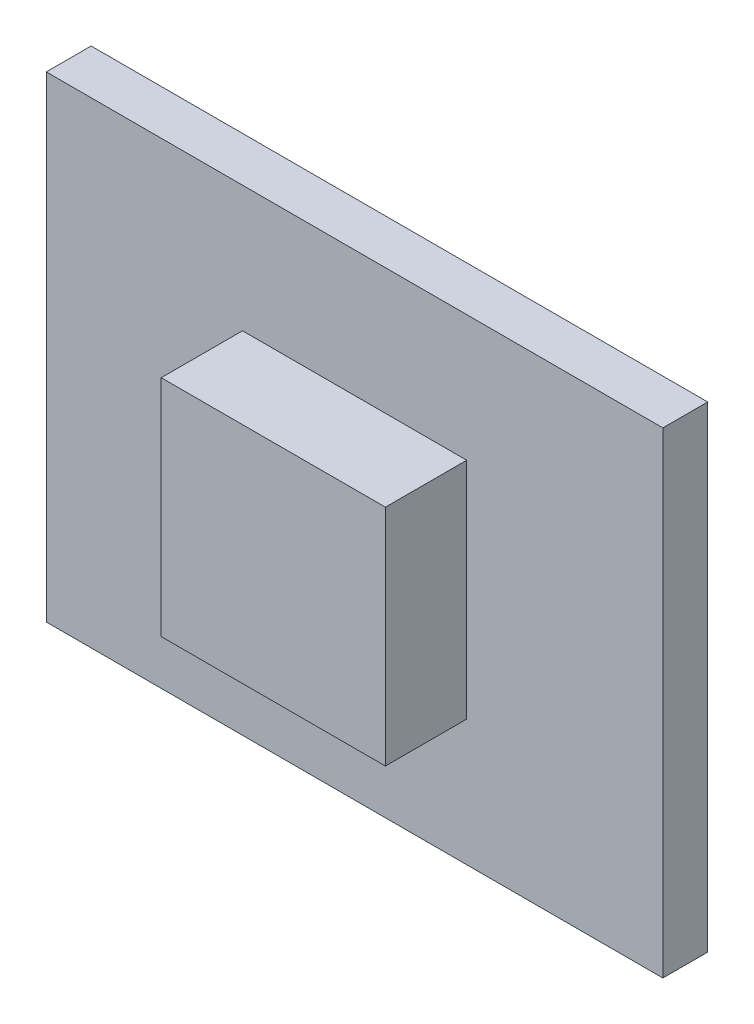
ISO-10303-21;
HEADER;
FILE_DESCRIPTION(('STEP AP214'),'2;1');
FILE_NAME('part.step','',(''),(''),'','','');
FILE_SCHEMA(('AUTOMOTIVE_DESIGN { 1 0 10303 214 1 1 1 1 }'));
ENDSEC;
DATA;
#1=APPLICATION_CONTEXT('core data for automotive mechanical design processes');
#2=APPLICATION_PROTOCOL_DEFINITION('international standard','automotive_design',2000,#1);
#3=PRODUCT_CONTEXT('',#1,'mechanical');
#4=PRODUCT('Part','Part','',(#3));
#5=PRODUCT_RELATED_PRODUCT_CATEGORY('part','',(#4));
#6=PRODUCT_DEFINITION_FORMATION('','',#4);
#7=PRODUCT_DEFINITION_CONTEXT('part definition',#1,'design');
#8=PRODUCT_DEFINITION('design','',#6,#7);
#9=PRODUCT_DEFINITION_SHAPE('','',#8);
#10=(LENGTH_UNIT() NAMED_UNIT(*) SI_UNIT(.MILLI.,.METRE.));
#11=(NAMED_UNIT(*) PLANE_ANGLE_UNIT() SI_UNIT($,.RADIAN.));
#12=(NAMED_UNIT(*) SI_UNIT($,.STERADIAN.) SOLID_ANGLE_UNIT());
#13=UNCERTAINTY_MEASURE_WITH_UNIT(LENGTH_MEASURE(1.E-05),#10,'distance_accuracy_value','');
#14=(GEOMETRIC_REPRESENTATION_CONTEXT(3) GLOBAL_UNCERTAINTY_ASSIGNED_CONTEXT((#13)) GLOBAL_UNIT_ASSIGNED_CONTEXT((#10,
#11,#12)) REPRESENTATION_CONTEXT('',''));
#15=CARTESIAN_POINT('',(0.,0.,0.));
#16=DIRECTION('',(0.,0.,1.));
#17=DIRECTION('',(1.,0.,0.));
#18=AXIS2_PLACEMENT_3D('',#15,#16,#17);
#19=CARTESIAN_POINT('',(-11.,8.5,1.6));
#20=DIRECTION('',(1.,0.,0.));
#21=DIRECTION('',(0.,0.,-1.));
#22=AXIS2_PLACEMENT_3D('',#19,#20,#21);
#23=PLANE('',#22);
#24=DIRECTION('',(0.,-1.,0.));
#25=VECTOR('',#24,1.);
#26=CARTESIAN_POINT('',(-11.,8.5,0.));
#27=LINE('',#26,#25);
#28=CARTESIAN_POINT('',(-11.,8.5,0.));
#29=VERTEX_POINT('',#28);
#30=CARTESIAN_POINT('',(-11.,-8.5,0.));
#31=VERTEX_POINT('',#30);
#32=EDGE_CURVE('E122',#29,#31,#27,.T.);
#33=ORIENTED_EDGE('',*,*,#32,.T.);
#34=DIRECTION('',(0.,0.,-1.));
#35=VECTOR('',#34,1.);
#36=CARTESIAN_POINT('',(-11.,-8.5,1.6));
#37=LINE('',#36,#35);
#38=CARTESIAN_POINT('',(-11.,-8.5,1.6));
#39=VERTEX_POINT('',#38);
#40=EDGE_CURVE('E11',#39,#31,#37,.T.);
#41=ORIENTED_EDGE('',*,*,#40,.F.);
#42=DIRECTION('',(0.,-1.,0.));
#43=VECTOR('',#42,1.);
#44=CARTESIAN_POINT('',(-11.,8.5,1.6));
#45=LINE('',#44,#43);
#46=CARTESIAN_POINT('',(-11.,8.5,1.6));
#47=VERTEX_POINT('',#46);
#48=EDGE_CURVE('E135',#47,#39,#45,.T.);
#49=ORIENTED_EDGE('',*,*,#48,.F.);
#50=DIRECTION('',(0.,0.,-1.));
#51=VECTOR('',#50,1.);
#52=CARTESIAN_POINT('',(-11.,8.5,1.6));
#53=LINE('',#52,#51);
#54=EDGE_CURVE('E143',#47,#29,#53,.T.);
#55=ORIENTED_EDGE('',*,*,#54,.T.);
#56=EDGE_LOOP('',(#33,#41,#49,#55));
#57=FACE_BOUND('',#56,.T.);
#58=ADVANCED_FACE('F39',(#57),#23,.F.);
#59=CARTESIAN_POINT('',(-11.,-8.5,1.6));
#60=DIRECTION('',(0.,1.,0.));
#61=DIRECTION('',(0.,0.,1.));
#62=AXIS2_PLACEMENT_3D('',#59,#60,#61);
#63=PLANE('',#62);
#64=DIRECTION('',(1.,0.,0.));
#65=VECTOR('',#64,1.);
#66=CARTESIAN_POINT('',(-11.,-8.5,0.));
#67=LINE('',#66,#65);
#68=CARTESIAN_POINT('',(11.,-8.5,0.));
#69=VERTEX_POINT('',#68);
#70=EDGE_CURVE('E127',#31,#69,#67,.T.);
#71=ORIENTED_EDGE('',*,*,#70,.T.);
#72=DIRECTION('',(0.,0.,-1.));
#73=VECTOR('',#72,1.);
#74=CARTESIAN_POINT('',(11.,-8.5,1.6));
#75=LINE('',#74,#73);
#76=CARTESIAN_POINT('',(11.,-8.5,1.6));
#77=VERTEX_POINT('',#76);
#78=EDGE_CURVE('E46',#77,#69,#75,.T.);
#79=ORIENTED_EDGE('',*,*,#78,.F.);
#80=DIRECTION('',(1.,0.,0.));
#81=VECTOR('',#80,1.);
#82=CARTESIAN_POINT('',(-11.,-8.5,1.6));
#83=LINE('',#82,#81);
#84=EDGE_CURVE('E133',#39,#77,#83,.T.);
#85=ORIENTED_EDGE('',*,*,#84,.F.);
#86=ORIENTED_EDGE('',*,*,#40,.T.);
#87=EDGE_LOOP('',(#71,#79,#85,#86));
#88=FACE_BOUND('',#87,.T.);
#89=ADVANCED_FACE('F175',(#88),#63,.F.);
#90=CARTESIAN_POINT('',(11.,-8.5,1.6));
#91=DIRECTION('',(-1.,0.,0.));
#92=DIRECTION('',(0.,0.,1.));
#93=AXIS2_PLACEMENT_3D('',#90,#91,#92);
#94=PLANE('',#93);
#95=DIRECTION('',(0.,1.,0.));
#96=VECTOR('',#95,1.);
#97=CARTESIAN_POINT('',(11.,-8.5,0.));
#98=LINE('',#97,#96);
#99=CARTESIAN_POINT('',(11.,8.5,0.));
#100=VERTEX_POINT('',#99);
#101=EDGE_CURVE('E145',#69,#100,#98,.T.);
#102=ORIENTED_EDGE('',*,*,#101,.T.);
#103=DIRECTION('',(0.,0.,-1.));
#104=VECTOR('',#103,1.);
#105=CARTESIAN_POINT('',(11.,8.5,1.6));
#106=LINE('',#105,#104);
#107=CARTESIAN_POINT('',(11.,8.5,1.6));
#108=VERTEX_POINT('',#107);
#109=EDGE_CURVE('E149',#108,#100,#106,.T.);
#110=ORIENTED_EDGE('',*,*,#109,.F.);
#111=DIRECTION('',(0.,1.,0.));
#112=VECTOR('',#111,1.);
#113=CARTESIAN_POINT('',(11.,-8.5,1.6));
#114=LINE('',#113,#112);
#115=EDGE_CURVE('E137',#77,#108,#114,.T.);
#116=ORIENTED_EDGE('',*,*,#115,.F.);
#117=ORIENTED_EDGE('',*,*,#78,.T.);
#118=EDGE_LOOP('',(#102,#110,#116,#117));
#119=FACE_BOUND('',#118,.T.);
#120=ADVANCED_FACE('F156',(#119),#94,.F.);
#121=CARTESIAN_POINT('',(11.,8.5,1.6));
#122=DIRECTION('',(0.,-1.,0.));
#123=DIRECTION('',(0.,0.,-1.));
#124=AXIS2_PLACEMENT_3D('',#121,#122,#123);
#125=PLANE('',#124);
#126=DIRECTION('',(-1.,0.,0.));
#127=VECTOR('',#126,1.);
#128=CARTESIAN_POINT('',(11.,8.5,0.));
#129=LINE('',#128,#127);
#130=EDGE_CURVE('E136',#100,#29,#129,.T.);
#131=ORIENTED_EDGE('',*,*,#130,.T.);
#132=ORIENTED_EDGE('',*,*,#54,.F.);
#133=DIRECTION('',(-1.,0.,0.));
#134=VECTOR('',#133,1.);
#135=CARTESIAN_POINT('',(11.,8.5,1.6));
#136=LINE('',#135,#134);
#137=EDGE_CURVE('E139',#108,#47,#136,.T.);
#138=ORIENTED_EDGE('',*,*,#137,.F.);
#139=ORIENTED_EDGE('',*,*,#109,.T.);
#140=EDGE_LOOP('',(#131,#132,#138,#139));
#141=FACE_BOUND('',#140,.T.);
#142=ADVANCED_FACE('F164',(#141),#125,.F.);
#143=CARTESIAN_POINT('',(0.,0.,1.6));
#144=DIRECTION('',(0.,0.,1.));
#145=DIRECTION('',(1.,0.,0.));
#146=AXIS2_PLACEMENT_3D('',#143,#144,#145);
#147=PLANE('',#146);
#148=DIRECTION('',(0.,-1.,0.));
#149=VECTOR('',#148,1.);
#150=CARTESIAN_POINT('',(-4.,4.,1.6));
#151=LINE('',#150,#149);
#152=CARTESIAN_POINT('',(-4.,4.,1.6));
#153=VERTEX_POINT('',#152);
#154=CARTESIAN_POINT('',(-4.,-4.,1.6));
#155=VERTEX_POINT('',#154);
#156=EDGE_CURVE('E52',#153,#155,#151,.T.);
#157=ORIENTED_EDGE('',*,*,#156,.F.);
#158=DIRECTION('',(-1.,0.,0.));
#159=VECTOR('',#158,1.);
#160=CARTESIAN_POINT('',(4.,4.,1.6));
#161=LINE('',#160,#159);
#162=CARTESIAN_POINT('',(4.,4.,1.6));
#163=VERTEX_POINT('',#162);
#164=EDGE_CURVE('E60',#163,#153,#161,.T.);
#165=ORIENTED_EDGE('',*,*,#164,.F.);
#166=DIRECTION('',(0.,1.,0.));
#167=VECTOR('',#166,1.);
#168=CARTESIAN_POINT('',(4.,-4.,1.6));
#169=LINE('',#168,#167);
#170=CARTESIAN_POINT('',(4.,-4.,1.6));
#171=VERTEX_POINT('',#170);
#172=EDGE_CURVE('E266',#171,#163,#169,.T.);
#173=ORIENTED_EDGE('',*,*,#172,.F.);
#174=DIRECTION('',(1.,0.,0.));
#175=VECTOR('',#174,1.);
#176=CARTESIAN_POINT('',(-4.,-4.,1.6));
#177=LINE('',#176,#175);
#178=EDGE_CURVE('E275',#155,#171,#177,.T.);
#179=ORIENTED_EDGE('',*,*,#178,.F.);
#180=EDGE_LOOP('',(#157,#165,#173,#179));
#181=FACE_BOUND('',#180,.T.);
#182=ORIENTED_EDGE('',*,*,#48,.T.);
#183=ORIENTED_EDGE('',*,*,#84,.T.);
#184=ORIENTED_EDGE('',*,*,#115,.T.);
#185=ORIENTED_EDGE('',*,*,#137,.T.);
#186=EDGE_LOOP('',(#182,#183,#184,#185));
#187=FACE_BOUND('',#186,.T.);
#188=ADVANCED_FACE('F172',(#181,#187),#147,.T.);
#189=CARTESIAN_POINT('',(0.,0.,0.));
#190=DIRECTION('',(0.,0.,1.));
#191=DIRECTION('',(1.,0.,0.));
#192=AXIS2_PLACEMENT_3D('',#189,#190,#191);
#193=PLANE('',#192);
#194=ORIENTED_EDGE('',*,*,#32,.F.);
#195=ORIENTED_EDGE('',*,*,#130,.F.);
#196=ORIENTED_EDGE('',*,*,#101,.F.);
#197=ORIENTED_EDGE('',*,*,#70,.F.);
#198=EDGE_LOOP('',(#194,#195,#196,#197));
#199=FACE_BOUND('',#198,.T.);
#200=ADVANCED_FACE('F165',(#199),#193,.F.);
#201=CARTESIAN_POINT('',(-4.,4.,4.5));
#202=DIRECTION('',(1.,0.,0.));
#203=DIRECTION('',(0.,0.,-1.));
#204=AXIS2_PLACEMENT_3D('',#201,#202,#203);
#205=PLANE('',#204);
#206=ORIENTED_EDGE('',*,*,#156,.T.);
#207=DIRECTION('',(0.,0.,-1.));
#208=VECTOR('',#207,1.);
#209=CARTESIAN_POINT('',(-4.,-4.,4.5));
#210=LINE('',#209,#208);
#211=CARTESIAN_POINT('',(-4.,-4.,4.5));
#212=VERTEX_POINT('',#211);
#213=EDGE_CURVE('E106',#212,#155,#210,.T.);
#214=ORIENTED_EDGE('',*,*,#213,.F.);
#215=DIRECTION('',(0.,-1.,0.));
#216=VECTOR('',#215,1.);
#217=CARTESIAN_POINT('',(-4.,4.,4.5));
#218=LINE('',#217,#216);
#219=CARTESIAN_POINT('',(-4.,4.,4.5));
#220=VERTEX_POINT('',#219);
#221=EDGE_CURVE('E115',#220,#212,#218,.T.);
#222=ORIENTED_EDGE('',*,*,#221,.F.);
#223=DIRECTION('',(0.,0.,-1.));
#224=VECTOR('',#223,1.);
#225=CARTESIAN_POINT('',(-4.,4.,4.5));
#226=LINE('',#225,#224);
#227=EDGE_CURVE('E262',#220,#153,#226,.T.);
#228=ORIENTED_EDGE('',*,*,#227,.T.);
#229=EDGE_LOOP('',(#206,#214,#222,#228));
#230=FACE_BOUND('',#229,.T.);
#231=ADVANCED_FACE('F125',(#230),#205,.F.);
#232=CARTESIAN_POINT('',(-4.,-4.,4.5));
#233=DIRECTION('',(0.,1.,0.));
#234=DIRECTION('',(0.,0.,1.));
#235=AXIS2_PLACEMENT_3D('',#232,#233,#234);
#236=PLANE('',#235);
#237=ORIENTED_EDGE('',*,*,#178,.T.);
#238=DIRECTION('',(0.,0.,-1.));
#239=VECTOR('',#238,1.);
#240=CARTESIAN_POINT('',(4.,-4.,4.5));
#241=LINE('',#240,#239);
#242=CARTESIAN_POINT('',(4.,-4.,4.5));
#243=VERTEX_POINT('',#242);
#244=EDGE_CURVE('E107',#243,#171,#241,.T.);
#245=ORIENTED_EDGE('',*,*,#244,.F.);
#246=DIRECTION('',(1.,0.,0.));
#247=VECTOR('',#246,1.);
#248=CARTESIAN_POINT('',(-4.,-4.,4.5));
#249=LINE('',#248,#247);
#250=EDGE_CURVE('E101',#212,#243,#249,.T.);
#251=ORIENTED_EDGE('',*,*,#250,.F.);
#252=ORIENTED_EDGE('',*,*,#213,.T.);
#253=EDGE_LOOP('',(#237,#245,#251,#252));
#254=FACE_BOUND('',#253,.T.);
#255=ADVANCED_FACE('F102',(#254),#236,.F.);
#256=CARTESIAN_POINT('',(4.,-4.,4.5));
#257=DIRECTION('',(-1.,0.,0.));
#258=DIRECTION('',(0.,0.,1.));
#259=AXIS2_PLACEMENT_3D('',#256,#257,#258);
#260=PLANE('',#259);
#261=ORIENTED_EDGE('',*,*,#172,.T.);
#262=DIRECTION('',(0.,0.,-1.));
#263=VECTOR('',#262,1.);
#264=CARTESIAN_POINT('',(4.,4.,4.5));
#265=LINE('',#264,#263);
#266=CARTESIAN_POINT('',(4.,4.,4.5));
#267=VERTEX_POINT('',#266);
#268=EDGE_CURVE('E126',#267,#163,#265,.T.);
#269=ORIENTED_EDGE('',*,*,#268,.F.);
#270=DIRECTION('',(0.,1.,0.));
#271=VECTOR('',#270,1.);
#272=CARTESIAN_POINT('',(4.,-4.,4.5));
#273=LINE('',#272,#271);
#274=EDGE_CURVE('E112',#243,#267,#273,.T.);
#275=ORIENTED_EDGE('',*,*,#274,.F.);
#276=ORIENTED_EDGE('',*,*,#244,.T.);
#277=EDGE_LOOP('',(#261,#269,#275,#276));
#278=FACE_BOUND('',#277,.T.);
#279=ADVANCED_FACE('F188',(#278),#260,.F.);
#280=CARTESIAN_POINT('',(4.,4.,4.5));
#281=DIRECTION('',(0.,-1.,0.));
#282=DIRECTION('',(0.,0.,-1.));
#283=AXIS2_PLACEMENT_3D('',#280,#281,#282);
#284=PLANE('',#283);
#285=ORIENTED_EDGE('',*,*,#164,.T.);
#286=ORIENTED_EDGE('',*,*,#227,.F.);
#287=DIRECTION('',(-1.,0.,0.));
#288=VECTOR('',#287,1.);
#289=CARTESIAN_POINT('',(4.,4.,4.5));
#290=LINE('',#289,#288);
#291=EDGE_CURVE('E120',#267,#220,#290,.T.);
#292=ORIENTED_EDGE('',*,*,#291,.F.);
#293=ORIENTED_EDGE('',*,*,#268,.T.);
#294=EDGE_LOOP('',(#285,#286,#292,#293));
#295=FACE_BOUND('',#294,.T.);
#296=ADVANCED_FACE('F192',(#295),#284,.F.);
#297=CARTESIAN_POINT('',(0.,0.,4.5));
#298=DIRECTION('',(0.,0.,1.));
#299=DIRECTION('',(1.,0.,0.));
#300=AXIS2_PLACEMENT_3D('',#297,#298,#299);
#301=PLANE('',#300);
#302=ORIENTED_EDGE('',*,*,#221,.T.);
#303=ORIENTED_EDGE('',*,*,#250,.T.);
#304=ORIENTED_EDGE('',*,*,#274,.T.);
#305=ORIENTED_EDGE('',*,*,#291,.T.);
#306=EDGE_LOOP('',(#302,#303,#304,#305));
#307=FACE_BOUND('',#306,.T.);
#308=ADVANCED_FACE('F113',(#307),#301,.T.);
#309=CLOSED_SHELL('',(#58,#89,#120,#142,#188,#200,#231,#255,#279,#296,#308));
#310=MANIFOLD_SOLID_BREP('B2',#309);
#311=ADVANCED_BREP_SHAPE_REPRESENTATION('',(#18,#310),#14);
#312=SHAPE_DEFINITION_REPRESENTATION(#9,#311);
ENDSEC;
END-ISO-10303-21;
